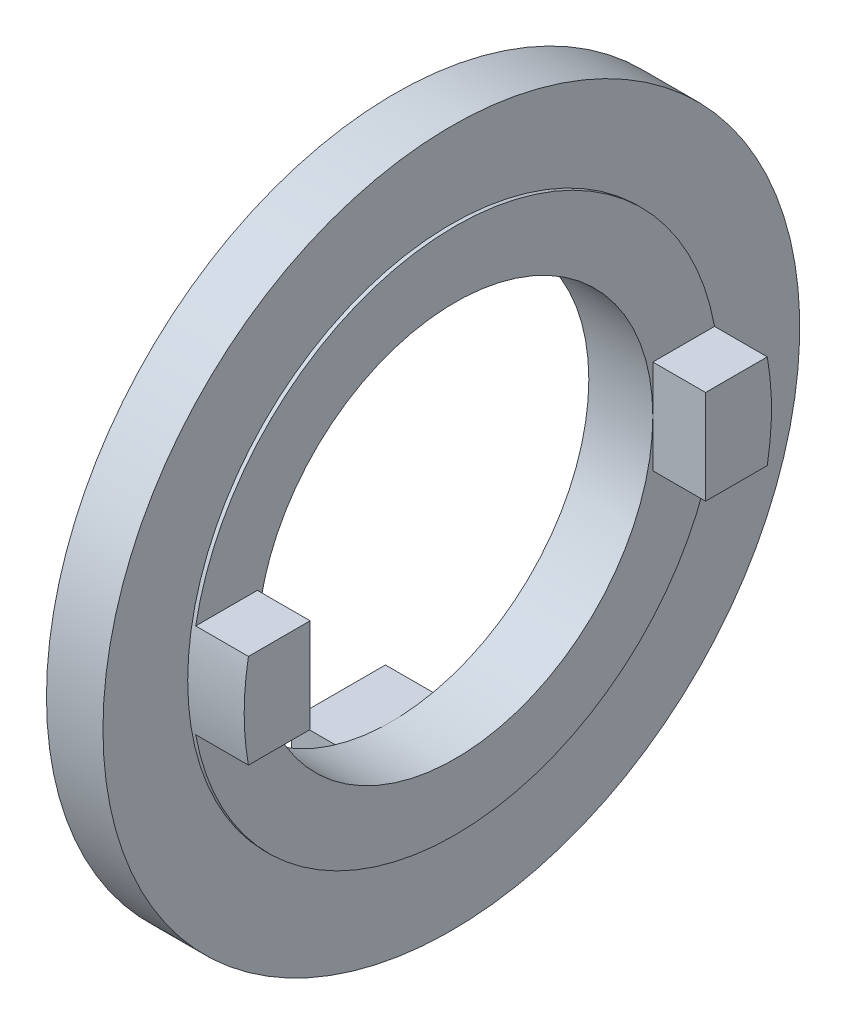
ISO-10303-21;
HEADER;
FILE_DESCRIPTION(('STEP AP214'),'2;1');
FILE_NAME('part.step','',(''),(''),'','','');
FILE_SCHEMA(('AUTOMOTIVE_DESIGN { 1 0 10303 214 1 1 1 1 }'));
ENDSEC;
DATA;
#1=APPLICATION_CONTEXT('core data for automotive mechanical design processes');
#2=APPLICATION_PROTOCOL_DEFINITION('international standard','automotive_design',2000,#1);
#3=PRODUCT_CONTEXT('',#1,'mechanical');
#4=PRODUCT('Part','Part','',(#3));
#5=PRODUCT_RELATED_PRODUCT_CATEGORY('part','',(#4));
#6=PRODUCT_DEFINITION_FORMATION('','',#4);
#7=PRODUCT_DEFINITION_CONTEXT('part definition',#1,'design');
#8=PRODUCT_DEFINITION('design','',#6,#7);
#9=PRODUCT_DEFINITION_SHAPE('','',#8);
#10=(LENGTH_UNIT() NAMED_UNIT(*) SI_UNIT(.MILLI.,.METRE.));
#11=(NAMED_UNIT(*) PLANE_ANGLE_UNIT() SI_UNIT($,.RADIAN.));
#12=(NAMED_UNIT(*) SI_UNIT($,.STERADIAN.) SOLID_ANGLE_UNIT());
#13=UNCERTAINTY_MEASURE_WITH_UNIT(LENGTH_MEASURE(1.E-05),#10,'distance_accuracy_value','');
#14=(GEOMETRIC_REPRESENTATION_CONTEXT(3) GLOBAL_UNCERTAINTY_ASSIGNED_CONTEXT((#13)) GLOBAL_UNIT_ASSIGNED_CONTEXT((#10,
#11,#12)) REPRESENTATION_CONTEXT('',''));
#15=CARTESIAN_POINT('',(0.,0.,0.));
#16=DIRECTION('',(0.,0.,1.));
#17=DIRECTION('',(1.,0.,0.));
#18=AXIS2_PLACEMENT_3D('',#15,#16,#17);
#19=CARTESIAN_POINT('',(0.,0.,0.));
#20=DIRECTION('',(-1.,0.,0.));
#21=DIRECTION('',(0.,0.,1.));
#22=AXIS2_PLACEMENT_3D('',#19,#20,#21);
#23=PLANE('',#22);
#24=DIRECTION('',(0.,1.,0.));
#25=VECTOR('',#24,1.);
#26=CARTESIAN_POINT('',(0.,10.5302728173508,2.5));
#27=LINE('',#26,#25);
#28=CARTESIAN_POINT('',(0.,13.7749773139559,2.5));
#29=VERTEX_POINT('',#28);
#30=CARTESIAN_POINT('',(0.,10.5302728173508,2.5));
#31=VERTEX_POINT('',#30);
#32=EDGE_CURVE('P0_E59',#29,#31,#27,.F.);
#33=ORIENTED_EDGE('',*,*,#32,.T.);
#34=DIRECTION('',(0.,0.,1.));
#35=VECTOR('',#34,1.);
#36=CARTESIAN_POINT('',(0.,10.5302728173508,2.5));
#37=LINE('',#36,#35);
#38=CARTESIAN_POINT('',(0.,10.5302728173508,-2.5));
#39=VERTEX_POINT('',#38);
#40=EDGE_CURVE('P0_E79',#31,#39,#37,.F.);
#41=ORIENTED_EDGE('',*,*,#40,.T.);
#42=DIRECTION('',(0.,1.,0.));
#43=VECTOR('',#42,1.);
#44=CARTESIAN_POINT('',(0.,10.5302728173508,-2.5));
#45=LINE('',#44,#43);
#46=CARTESIAN_POINT('',(0.,13.7749773139559,-2.5));
#47=VERTEX_POINT('',#46);
#48=EDGE_CURVE('P0_E60',#39,#47,#45,.T.);
#49=ORIENTED_EDGE('',*,*,#48,.T.);
#50=CARTESIAN_POINT('',(0.,0.,0.));
#51=DIRECTION('',(1.,0.,0.));
#52=DIRECTION('',(0.,0.,-1.));
#53=AXIS2_PLACEMENT_3D('',#50,#51,#52);
#54=CIRCLE('',#53,14.);
#55=EDGE_CURVE('P0_E20',#29,#47,#54,.F.);
#56=ORIENTED_EDGE('',*,*,#55,.F.);
#57=EDGE_LOOP('',(#33,#41,#49,#56));
#58=FACE_BOUND('',#57,.T.);
#59=ADVANCED_FACE('P0_F17',(#58),#23,.F.);
#60=CARTESIAN_POINT('',(-2.8,0.,0.));
#61=DIRECTION('',(1.,0.,0.));
#62=DIRECTION('',(0.,0.,-1.));
#63=AXIS2_PLACEMENT_3D('',#60,#61,#62);
#64=CYLINDRICAL_SURFACE('',#63,14.);
#65=CARTESIAN_POINT('',(-2.8,0.,0.));
#66=DIRECTION('',(1.,0.,0.));
#67=DIRECTION('',(0.,0.,-1.));
#68=AXIS2_PLACEMENT_3D('',#65,#66,#67);
#69=CIRCLE('',#68,14.);
#70=CARTESIAN_POINT('',(-2.8,13.7749773139559,2.5));
#71=VERTEX_POINT('',#70);
#72=CARTESIAN_POINT('',(-2.8,13.7749773139559,-2.5));
#73=VERTEX_POINT('',#72);
#74=EDGE_CURVE('P0_E68',#71,#73,#69,.F.);
#75=ORIENTED_EDGE('',*,*,#74,.F.);
#76=DIRECTION('',(-1.,0.,0.));
#77=VECTOR('',#76,1.);
#78=CARTESIAN_POINT('',(-2.8,13.7749773139559,2.5));
#79=LINE('',#78,#77);
#80=EDGE_CURVE('P0_E65',#71,#29,#79,.F.);
#81=ORIENTED_EDGE('',*,*,#80,.T.);
#82=ORIENTED_EDGE('',*,*,#55,.T.);
#83=DIRECTION('',(1.,0.,0.));
#84=VECTOR('',#83,1.);
#85=CARTESIAN_POINT('',(-2.8,13.7749773139559,-2.5));
#86=LINE('',#85,#84);
#87=EDGE_CURVE('P0_E63',#47,#73,#86,.F.);
#88=ORIENTED_EDGE('',*,*,#87,.T.);
#89=EDGE_LOOP('',(#75,#81,#82,#88));
#90=FACE_BOUND('',#89,.T.);
#91=ADVANCED_FACE('P0_F66',(#90),#64,.T.);
#92=CARTESIAN_POINT('',(-2.8,10.5302728173508,-2.5));
#93=DIRECTION('',(0.,0.,1.));
#94=DIRECTION('',(1.,0.,0.));
#95=AXIS2_PLACEMENT_3D('',#92,#93,#94);
#96=PLANE('',#95);
#97=DIRECTION('',(1.,0.,0.));
#98=VECTOR('',#97,1.);
#99=CARTESIAN_POINT('',(-2.8,10.5302728173508,-2.5));
#100=LINE('',#99,#98);
#101=CARTESIAN_POINT('',(-2.8,10.5302728173508,-2.5));
#102=VERTEX_POINT('',#101);
#103=EDGE_CURVE('P0_E81',#39,#102,#100,.F.);
#104=ORIENTED_EDGE('',*,*,#103,.T.);
#105=DIRECTION('',(0.,1.,0.));
#106=VECTOR('',#105,1.);
#107=CARTESIAN_POINT('',(-2.8,0.,-2.5));
#108=LINE('',#107,#106);
#109=EDGE_CURVE('P0_E73',#73,#102,#108,.F.);
#110=ORIENTED_EDGE('',*,*,#109,.F.);
#111=ORIENTED_EDGE('',*,*,#87,.F.);
#112=ORIENTED_EDGE('',*,*,#48,.F.);
#113=EDGE_LOOP('',(#104,#110,#111,#112));
#114=FACE_BOUND('',#113,.T.);
#115=ADVANCED_FACE('P0_F90',(#114),#96,.F.);
#116=CARTESIAN_POINT('',(-2.8,10.5302728173508,2.5));
#117=DIRECTION('',(0.,1.,0.));
#118=DIRECTION('',(0.,0.,1.));
#119=AXIS2_PLACEMENT_3D('',#116,#117,#118);
#120=PLANE('',#119);
#121=DIRECTION('',(-1.,0.,0.));
#122=VECTOR('',#121,1.);
#123=CARTESIAN_POINT('',(-2.8,10.5302728173508,2.5));
#124=LINE('',#123,#122);
#125=CARTESIAN_POINT('',(-2.8,10.5302728173508,2.5));
#126=VERTEX_POINT('',#125);
#127=EDGE_CURVE('P0_E35',#31,#126,#124,.T.);
#128=ORIENTED_EDGE('',*,*,#127,.T.);
#129=DIRECTION('',(0.,0.,1.));
#130=VECTOR('',#129,1.);
#131=CARTESIAN_POINT('',(-2.8,10.5302728173508,0.));
#132=LINE('',#131,#130);
#133=EDGE_CURVE('P0_E26',#102,#126,#132,.T.);
#134=ORIENTED_EDGE('',*,*,#133,.F.);
#135=ORIENTED_EDGE('',*,*,#103,.F.);
#136=ORIENTED_EDGE('',*,*,#40,.F.);
#137=EDGE_LOOP('',(#128,#134,#135,#136));
#138=FACE_BOUND('',#137,.T.);
#139=ADVANCED_FACE('P0_F107',(#138),#120,.F.);
#140=CARTESIAN_POINT('',(-2.8,10.5302728173508,2.5));
#141=DIRECTION('',(0.,0.,-1.));
#142=DIRECTION('',(-1.,0.,0.));
#143=AXIS2_PLACEMENT_3D('',#140,#141,#142);
#144=PLANE('',#143);
#145=ORIENTED_EDGE('',*,*,#80,.F.);
#146=DIRECTION('',(0.,1.,0.));
#147=VECTOR('',#146,1.);
#148=CARTESIAN_POINT('',(-2.8,0.,2.5));
#149=LINE('',#148,#147);
#150=EDGE_CURVE('P0_E11',#126,#71,#149,.T.);
#151=ORIENTED_EDGE('',*,*,#150,.F.);
#152=ORIENTED_EDGE('',*,*,#127,.F.);
#153=ORIENTED_EDGE('',*,*,#32,.F.);
#154=EDGE_LOOP('',(#145,#151,#152,#153));
#155=FACE_BOUND('',#154,.T.);
#156=ADVANCED_FACE('P0_F71',(#155),#144,.F.);
#157=CARTESIAN_POINT('',(-2.8,0.,0.));
#158=DIRECTION('',(-1.,0.,0.));
#159=DIRECTION('',(0.,0.,1.));
#160=AXIS2_PLACEMENT_3D('',#157,#158,#159);
#161=PLANE('',#160);
#162=ORIENTED_EDGE('',*,*,#133,.T.);
#163=ORIENTED_EDGE('',*,*,#150,.T.);
#164=ORIENTED_EDGE('',*,*,#74,.T.);
#165=ORIENTED_EDGE('',*,*,#109,.T.);
#166=EDGE_LOOP('',(#162,#163,#164,#165));
#167=FACE_BOUND('',#166,.T.);
#168=ADVANCED_FACE('P0_F95',(#167),#161,.T.);
#169=CLOSED_SHELL('',(#59,#91,#115,#139,#156,#168));
#170=MANIFOLD_SOLID_BREP('P0_B1',#169);
#171=CARTESIAN_POINT('',(6.2,-2.5,10.5));
#172=DIRECTION('',(0.,0.,1.));
#173=DIRECTION('',(1.,0.,0.));
#174=AXIS2_PLACEMENT_3D('',#171,#172,#173);
#175=PLANE('',#174);
#176=DIRECTION('',(0.,1.,0.));
#177=VECTOR('',#176,1.);
#178=CARTESIAN_POINT('',(3.4,10.5,10.5));
#179=LINE('',#178,#177);
#180=CARTESIAN_POINT('',(3.4,0.,10.5));
#181=VERTEX_POINT('',#180);
#182=CARTESIAN_POINT('',(3.4,2.5,10.5));
#183=VERTEX_POINT('',#182);
#184=EDGE_CURVE('P1_E103',#181,#183,#179,.T.);
#185=ORIENTED_EDGE('',*,*,#184,.T.);
#186=DIRECTION('',(1.,0.,0.));
#187=VECTOR('',#186,1.);
#188=CARTESIAN_POINT('',(6.2,2.5,10.5));
#189=LINE('',#188,#187);
#190=CARTESIAN_POINT('',(6.2,2.5,10.5));
#191=VERTEX_POINT('',#190);
#192=EDGE_CURVE('P1_E214',#183,#191,#189,.T.);
#193=ORIENTED_EDGE('',*,*,#192,.T.);
#194=DIRECTION('',(0.,1.,0.));
#195=VECTOR('',#194,1.);
#196=CARTESIAN_POINT('',(6.2,0.,10.5));
#197=LINE('',#196,#195);
#198=CARTESIAN_POINT('',(6.2,-2.5,10.5));
#199=VERTEX_POINT('',#198);
#200=EDGE_CURVE('P1_E162',#191,#199,#197,.F.);
#201=ORIENTED_EDGE('',*,*,#200,.T.);
#202=DIRECTION('',(1.,0.,0.));
#203=VECTOR('',#202,1.);
#204=CARTESIAN_POINT('',(6.2,-2.5,10.5));
#205=LINE('',#204,#203);
#206=CARTESIAN_POINT('',(3.4,-2.5,10.5));
#207=VERTEX_POINT('',#206);
#208=EDGE_CURVE('P1_E188',#199,#207,#205,.F.);
#209=ORIENTED_EDGE('',*,*,#208,.T.);
#210=DIRECTION('',(0.,1.,0.));
#211=VECTOR('',#210,1.);
#212=CARTESIAN_POINT('',(3.4,10.5,10.5));
#213=LINE('',#212,#211);
#214=EDGE_CURVE('P1_E157',#207,#181,#213,.T.);
#215=ORIENTED_EDGE('',*,*,#214,.T.);
#216=EDGE_LOOP('',(#185,#193,#201,#209,#215));
#217=FACE_BOUND('',#216,.T.);
#218=ADVANCED_FACE('P1_F17',(#217),#175,.F.);
#219=CARTESIAN_POINT('',(6.2,-2.5,-10.5));
#220=DIRECTION('',(0.,0.,-1.));
#221=DIRECTION('',(-1.,0.,0.));
#222=AXIS2_PLACEMENT_3D('',#219,#220,#221);
#223=PLANE('',#222);
#224=DIRECTION('',(0.,1.,0.));
#225=VECTOR('',#224,1.);
#226=CARTESIAN_POINT('',(3.4,10.5,-10.5));
#227=LINE('',#226,#225);
#228=CARTESIAN_POINT('',(3.4,0.,-10.5));
#229=VERTEX_POINT('',#228);
#230=CARTESIAN_POINT('',(3.4,-2.5,-10.5));
#231=VERTEX_POINT('',#230);
#232=EDGE_CURVE('P1_E93',#229,#231,#227,.F.);
#233=ORIENTED_EDGE('',*,*,#232,.T.);
#234=DIRECTION('',(1.,0.,0.));
#235=VECTOR('',#234,1.);
#236=CARTESIAN_POINT('',(6.2,-2.5,-10.5));
#237=LINE('',#236,#235);
#238=CARTESIAN_POINT('',(6.2,-2.5,-10.5));
#239=VERTEX_POINT('',#238);
#240=EDGE_CURVE('P1_E152',#231,#239,#237,.T.);
#241=ORIENTED_EDGE('',*,*,#240,.T.);
#242=DIRECTION('',(0.,1.,0.));
#243=VECTOR('',#242,1.);
#244=CARTESIAN_POINT('',(6.2,0.,-10.5));
#245=LINE('',#244,#243);
#246=CARTESIAN_POINT('',(6.2,2.5,-10.5));
#247=VERTEX_POINT('',#246);
#248=EDGE_CURVE('P1_E137',#247,#239,#245,.F.);
#249=ORIENTED_EDGE('',*,*,#248,.F.);
#250=DIRECTION('',(1.,0.,0.));
#251=VECTOR('',#250,1.);
#252=CARTESIAN_POINT('',(6.2,2.5,-10.5));
#253=LINE('',#252,#251);
#254=CARTESIAN_POINT('',(3.4,2.5,-10.5));
#255=VERTEX_POINT('',#254);
#256=EDGE_CURVE('P1_E178',#247,#255,#253,.F.);
#257=ORIENTED_EDGE('',*,*,#256,.T.);
#258=DIRECTION('',(0.,1.,0.));
#259=VECTOR('',#258,1.);
#260=CARTESIAN_POINT('',(3.4,10.5,-10.5));
#261=LINE('',#260,#259);
#262=EDGE_CURVE('P1_E112',#255,#229,#261,.F.);
#263=ORIENTED_EDGE('',*,*,#262,.T.);
#264=EDGE_LOOP('',(#233,#241,#249,#257,#263));
#265=FACE_BOUND('',#264,.T.);
#266=ADVANCED_FACE('P1_F153',(#265),#223,.F.);
#267=CARTESIAN_POINT('',(6.2,-2.5,-10.5));
#268=DIRECTION('',(0.,1.,0.));
#269=DIRECTION('',(0.,0.,1.));
#270=AXIS2_PLACEMENT_3D('',#267,#268,#269);
#271=PLANE('',#270);
#272=DIRECTION('',(-1.,0.,0.));
#273=VECTOR('',#272,1.);
#274=CARTESIAN_POINT('',(0.,-2.5,-13.7749773139559));
#275=LINE('',#274,#273);
#276=CARTESIAN_POINT('',(6.2,-2.5,-13.7749773139559));
#277=VERTEX_POINT('',#276);
#278=CARTESIAN_POINT('',(3.4,-2.5,-13.7749773139559));
#279=VERTEX_POINT('',#278);
#280=EDGE_CURVE('P1_E160',#277,#279,#275,.T.);
#281=ORIENTED_EDGE('',*,*,#280,.F.);
#282=DIRECTION('',(0.,0.,-1.));
#283=VECTOR('',#282,1.);
#284=CARTESIAN_POINT('',(6.2,-2.5,0.));
#285=LINE('',#284,#283);
#286=EDGE_CURVE('P1_E142',#239,#277,#285,.T.);
#287=ORIENTED_EDGE('',*,*,#286,.F.);
#288=ORIENTED_EDGE('',*,*,#240,.F.);
#289=DIRECTION('',(0.,0.,1.));
#290=VECTOR('',#289,1.);
#291=CARTESIAN_POINT('',(3.4,-2.5,0.));
#292=LINE('',#291,#290);
#293=EDGE_CURVE('P1_E191',#231,#279,#292,.F.);
#294=ORIENTED_EDGE('',*,*,#293,.T.);
#295=EDGE_LOOP('',(#281,#287,#288,#294));
#296=FACE_BOUND('',#295,.T.);
#297=ADVANCED_FACE('P1_F159',(#296),#271,.F.);
#298=CARTESIAN_POINT('',(3.4,10.5,0.));
#299=DIRECTION('',(-1.,0.,0.));
#300=DIRECTION('',(0.,0.,1.));
#301=AXIS2_PLACEMENT_3D('',#298,#299,#300);
#302=PLANE('',#301);
#303=CARTESIAN_POINT('',(3.4,0.,0.));
#304=DIRECTION('',(-1.,0.,0.));
#305=DIRECTION('',(0.,0.,1.));
#306=AXIS2_PLACEMENT_3D('',#303,#304,#305);
#307=CIRCLE('',#306,14.);
#308=CARTESIAN_POINT('',(3.4,-2.5,13.7749773139559));
#309=VERTEX_POINT('',#308);
#310=EDGE_CURVE('P1_E185',#279,#309,#307,.T.);
#311=ORIENTED_EDGE('',*,*,#310,.F.);
#312=ORIENTED_EDGE('',*,*,#293,.F.);
#313=ORIENTED_EDGE('',*,*,#232,.F.);
#314=CARTESIAN_POINT('',(3.4,0.,0.));
#315=DIRECTION('',(-1.,0.,0.));
#316=DIRECTION('',(0.,0.,1.));
#317=AXIS2_PLACEMENT_3D('',#314,#315,#316);
#318=CIRCLE('',#317,10.5);
#319=EDGE_CURVE('P1_E20',#229,#181,#318,.T.);
#320=ORIENTED_EDGE('',*,*,#319,.T.);
#321=ORIENTED_EDGE('',*,*,#214,.F.);
#322=DIRECTION('',(0.,0.,1.));
#323=VECTOR('',#322,1.);
#324=CARTESIAN_POINT('',(3.4,-2.5,10.5));
#325=LINE('',#324,#323);
#326=EDGE_CURVE('P1_E149',#207,#309,#325,.T.);
#327=ORIENTED_EDGE('',*,*,#326,.T.);
#328=EDGE_LOOP('',(#311,#312,#313,#320,#321,#327));
#329=FACE_BOUND('',#328,.T.);
#330=ADVANCED_FACE('P1_F439',(#329),#302,.F.);
#331=CARTESIAN_POINT('',(6.2,-2.5,10.5));
#332=DIRECTION('',(0.,1.,0.));
#333=DIRECTION('',(0.,0.,1.));
#334=AXIS2_PLACEMENT_3D('',#331,#332,#333);
#335=PLANE('',#334);
#336=ORIENTED_EDGE('',*,*,#208,.F.);
#337=DIRECTION('',(0.,0.,1.));
#338=VECTOR('',#337,1.);
#339=CARTESIAN_POINT('',(6.2,-2.5,0.));
#340=LINE('',#339,#338);
#341=CARTESIAN_POINT('',(6.2,-2.5,13.7749773139559));
#342=VERTEX_POINT('',#341);
#343=EDGE_CURVE('P1_E168',#199,#342,#340,.T.);
#344=ORIENTED_EDGE('',*,*,#343,.T.);
#345=DIRECTION('',(-1.,0.,0.));
#346=VECTOR('',#345,1.);
#347=CARTESIAN_POINT('',(0.,-2.5,13.7749773139559));
#348=LINE('',#347,#346);
#349=EDGE_CURVE('P1_E181',#309,#342,#348,.F.);
#350=ORIENTED_EDGE('',*,*,#349,.F.);
#351=ORIENTED_EDGE('',*,*,#326,.F.);
#352=EDGE_LOOP('',(#336,#344,#350,#351));
#353=FACE_BOUND('',#352,.T.);
#354=ADVANCED_FACE('P1_F292',(#353),#335,.F.);
#355=CARTESIAN_POINT('',(6.2,0.,0.));
#356=DIRECTION('',(1.,0.,0.));
#357=DIRECTION('',(0.,0.,-1.));
#358=AXIS2_PLACEMENT_3D('',#355,#356,#357);
#359=PLANE('',#358);
#360=ORIENTED_EDGE('',*,*,#248,.T.);
#361=ORIENTED_EDGE('',*,*,#286,.T.);
#362=CARTESIAN_POINT('',(6.2,0.,0.));
#363=DIRECTION('',(-1.,0.,0.));
#364=DIRECTION('',(0.,0.,1.));
#365=AXIS2_PLACEMENT_3D('',#362,#363,#364);
#366=CIRCLE('',#365,14.);
#367=CARTESIAN_POINT('',(6.2,2.5,-13.7749773139559));
#368=VERTEX_POINT('',#367);
#369=EDGE_CURVE('P1_E184',#368,#277,#366,.T.);
#370=ORIENTED_EDGE('',*,*,#369,.F.);
#371=DIRECTION('',(0.,0.,-1.));
#372=VECTOR('',#371,1.);
#373=CARTESIAN_POINT('',(6.2,2.5,-10.5));
#374=LINE('',#373,#372);
#375=EDGE_CURVE('P1_E144',#368,#247,#374,.F.);
#376=ORIENTED_EDGE('',*,*,#375,.T.);
#377=EDGE_LOOP('',(#360,#361,#370,#376));
#378=FACE_BOUND('',#377,.T.);
#379=ADVANCED_FACE('P1_F139',(#378),#359,.T.);
#380=CARTESIAN_POINT('',(6.2,0.,0.));
#381=DIRECTION('',(-1.,0.,0.));
#382=DIRECTION('',(0.,0.,1.));
#383=AXIS2_PLACEMENT_3D('',#380,#381,#382);
#384=PLANE('',#383);
#385=CARTESIAN_POINT('',(6.2,0.,0.));
#386=DIRECTION('',(-1.,0.,0.));
#387=DIRECTION('',(0.,0.,1.));
#388=AXIS2_PLACEMENT_3D('',#385,#386,#387);
#389=CIRCLE('',#388,14.);
#390=CARTESIAN_POINT('',(6.2,2.5,13.7749773139559));
#391=VERTEX_POINT('',#390);
#392=EDGE_CURVE('P1_E258',#342,#391,#389,.T.);
#393=ORIENTED_EDGE('',*,*,#392,.F.);
#394=ORIENTED_EDGE('',*,*,#343,.F.);
#395=ORIENTED_EDGE('',*,*,#200,.F.);
#396=DIRECTION('',(0.,0.,-1.));
#397=VECTOR('',#396,1.);
#398=CARTESIAN_POINT('',(6.2,2.5,10.5));
#399=LINE('',#398,#397);
#400=EDGE_CURVE('P1_E217',#191,#391,#399,.F.);
#401=ORIENTED_EDGE('',*,*,#400,.T.);
#402=EDGE_LOOP('',(#393,#394,#395,#401));
#403=FACE_BOUND('',#402,.T.);
#404=ADVANCED_FACE('P1_F295',(#403),#384,.F.);
#405=CARTESIAN_POINT('',(6.2,2.5,10.5));
#406=DIRECTION('',(0.,-1.,0.));
#407=DIRECTION('',(0.,0.,-1.));
#408=AXIS2_PLACEMENT_3D('',#405,#406,#407);
#409=PLANE('',#408);
#410=DIRECTION('',(-1.,0.,0.));
#411=VECTOR('',#410,1.);
#412=CARTESIAN_POINT('',(0.,2.5,13.7749773139559));
#413=LINE('',#412,#411);
#414=CARTESIAN_POINT('',(3.4,2.5,13.7749773139559));
#415=VERTEX_POINT('',#414);
#416=EDGE_CURVE('P1_E257',#391,#415,#413,.T.);
#417=ORIENTED_EDGE('',*,*,#416,.F.);
#418=ORIENTED_EDGE('',*,*,#400,.F.);
#419=ORIENTED_EDGE('',*,*,#192,.F.);
#420=DIRECTION('',(0.,0.,1.));
#421=VECTOR('',#420,1.);
#422=CARTESIAN_POINT('',(3.4,2.5,0.));
#423=LINE('',#422,#421);
#424=EDGE_CURVE('P1_E286',#183,#415,#423,.T.);
#425=ORIENTED_EDGE('',*,*,#424,.T.);
#426=EDGE_LOOP('',(#417,#418,#419,#425));
#427=FACE_BOUND('',#426,.T.);
#428=ADVANCED_FACE('P1_F301',(#427),#409,.F.);
#429=CARTESIAN_POINT('',(3.4,10.5,0.));
#430=DIRECTION('',(-1.,0.,0.));
#431=DIRECTION('',(0.,0.,1.));
#432=AXIS2_PLACEMENT_3D('',#429,#430,#431);
#433=PLANE('',#432);
#434=CARTESIAN_POINT('',(3.4,0.,0.));
#435=DIRECTION('',(-1.,0.,0.));
#436=DIRECTION('',(0.,0.,1.));
#437=AXIS2_PLACEMENT_3D('',#434,#435,#436);
#438=CIRCLE('',#437,10.5);
#439=EDGE_CURVE('P1_E206',#181,#229,#438,.T.);
#440=ORIENTED_EDGE('',*,*,#439,.T.);
#441=ORIENTED_EDGE('',*,*,#262,.F.);
#442=DIRECTION('',(0.,0.,-1.));
#443=VECTOR('',#442,1.);
#444=CARTESIAN_POINT('',(3.4,2.5,-10.5));
#445=LINE('',#444,#443);
#446=CARTESIAN_POINT('',(3.4,2.5,-13.7749773139559));
#447=VERTEX_POINT('',#446);
#448=EDGE_CURVE('P1_E209',#255,#447,#445,.T.);
#449=ORIENTED_EDGE('',*,*,#448,.T.);
#450=CARTESIAN_POINT('',(3.4,0.,0.));
#451=DIRECTION('',(-1.,0.,0.));
#452=DIRECTION('',(0.,0.,1.));
#453=AXIS2_PLACEMENT_3D('',#450,#451,#452);
#454=CIRCLE('',#453,14.);
#455=EDGE_CURVE('P1_E253',#415,#447,#454,.T.);
#456=ORIENTED_EDGE('',*,*,#455,.F.);
#457=ORIENTED_EDGE('',*,*,#424,.F.);
#458=ORIENTED_EDGE('',*,*,#184,.F.);
#459=EDGE_LOOP('',(#440,#441,#449,#456,#457,#458));
#460=FACE_BOUND('',#459,.T.);
#461=ADVANCED_FACE('P1_F302',(#460),#433,.F.);
#462=CARTESIAN_POINT('',(6.2,2.5,-10.5));
#463=DIRECTION('',(0.,-1.,0.));
#464=DIRECTION('',(0.,0.,-1.));
#465=AXIS2_PLACEMENT_3D('',#462,#463,#464);
#466=PLANE('',#465);
#467=ORIENTED_EDGE('',*,*,#256,.F.);
#468=ORIENTED_EDGE('',*,*,#375,.F.);
#469=DIRECTION('',(-1.,0.,0.));
#470=VECTOR('',#469,1.);
#471=CARTESIAN_POINT('',(0.,2.5,-13.7749773139559));
#472=LINE('',#471,#470);
#473=EDGE_CURVE('P1_E256',#447,#368,#472,.F.);
#474=ORIENTED_EDGE('',*,*,#473,.F.);
#475=ORIENTED_EDGE('',*,*,#448,.F.);
#476=EDGE_LOOP('',(#467,#468,#474,#475));
#477=FACE_BOUND('',#476,.T.);
#478=ADVANCED_FACE('P1_F424',(#477),#466,.F.);
#479=CARTESIAN_POINT('',(0.,0.,0.));
#480=DIRECTION('',(-1.,0.,0.));
#481=DIRECTION('',(0.,0.,1.));
#482=AXIS2_PLACEMENT_3D('',#479,#480,#481);
#483=CYLINDRICAL_SURFACE('',#482,10.5);
#484=ORIENTED_EDGE('',*,*,#439,.F.);
#485=ORIENTED_EDGE('',*,*,#319,.F.);
#486=EDGE_LOOP('',(#484,#485));
#487=FACE_BOUND('',#486,.T.);
#488=CARTESIAN_POINT('',(0.,0.,0.));
#489=DIRECTION('',(-1.,0.,0.));
#490=DIRECTION('',(0.,0.,1.));
#491=AXIS2_PLACEMENT_3D('',#488,#489,#490);
#492=CIRCLE('',#491,10.5);
#493=CARTESIAN_POINT('',(0.,0.,10.5));
#494=VERTEX_POINT('',#493);
#495=EDGE_CURVE('P1_E247',#494,#494,#492,.T.);
#496=ORIENTED_EDGE('',*,*,#495,.T.);
#497=EDGE_LOOP('',(#496));
#498=FACE_BOUND('',#497,.T.);
#499=ADVANCED_FACE('P1_F421',(#487,#498),#483,.F.);
#500=CARTESIAN_POINT('',(-2.8,-10.5302728173508,-2.5));
#501=DIRECTION('',(0.,-1.,0.));
#502=DIRECTION('',(0.,0.,-1.));
#503=AXIS2_PLACEMENT_3D('',#500,#501,#502);
#504=PLANE('',#503);
#505=DIRECTION('',(1.,0.,0.));
#506=VECTOR('',#505,1.);
#507=CARTESIAN_POINT('',(-2.8,-10.5302728173508,-2.5));
#508=LINE('',#507,#506);
#509=CARTESIAN_POINT('',(0.,-10.5302728173508,-2.5));
#510=VERTEX_POINT('',#509);
#511=CARTESIAN_POINT('',(-2.8,-10.5302728173508,-2.5));
#512=VERTEX_POINT('',#511);
#513=EDGE_CURVE('P1_E320',#510,#512,#508,.F.);
#514=ORIENTED_EDGE('',*,*,#513,.T.);
#515=DIRECTION('',(0.,0.,1.));
#516=VECTOR('',#515,1.);
#517=CARTESIAN_POINT('',(-2.8,-10.5302728173508,0.));
#518=LINE('',#517,#516);
#519=CARTESIAN_POINT('',(-2.8,-10.5302728173508,2.5));
#520=VERTEX_POINT('',#519);
#521=EDGE_CURVE('P1_E316',#520,#512,#518,.F.);
#522=ORIENTED_EDGE('',*,*,#521,.F.);
#523=DIRECTION('',(-1.,0.,0.));
#524=VECTOR('',#523,1.);
#525=CARTESIAN_POINT('',(-2.8,-10.5302728173508,2.5));
#526=LINE('',#525,#524);
#527=CARTESIAN_POINT('',(0.,-10.5302728173508,2.5));
#528=VERTEX_POINT('',#527);
#529=EDGE_CURVE('P1_E282',#520,#528,#526,.F.);
#530=ORIENTED_EDGE('',*,*,#529,.T.);
#531=DIRECTION('',(0.,0.,-1.));
#532=VECTOR('',#531,1.);
#533=CARTESIAN_POINT('',(0.,-10.5302728173508,0.));
#534=LINE('',#533,#532);
#535=EDGE_CURVE('P1_E329',#528,#510,#534,.T.);
#536=ORIENTED_EDGE('',*,*,#535,.T.);
#537=EDGE_LOOP('',(#514,#522,#530,#536));
#538=FACE_BOUND('',#537,.T.);
#539=ADVANCED_FACE('P1_F370',(#538),#504,.F.);
#540=CARTESIAN_POINT('',(0.,0.,0.));
#541=DIRECTION('',(-1.,0.,0.));
#542=DIRECTION('',(0.,0.,1.));
#543=AXIS2_PLACEMENT_3D('',#540,#541,#542);
#544=CYLINDRICAL_SURFACE('',#543,14.);
#545=CARTESIAN_POINT('',(3.2,0.,0.));
#546=DIRECTION('',(-1.,0.,0.));
#547=DIRECTION('',(0.,0.,1.));
#548=AXIS2_PLACEMENT_3D('',#545,#546,#547);
#549=CIRCLE('',#548,14.);
#550=CARTESIAN_POINT('',(3.2,0.,14.));
#551=VERTEX_POINT('',#550);
#552=EDGE_CURVE('P1_E242',#551,#551,#549,.F.);
#553=ORIENTED_EDGE('',*,*,#552,.T.);
#554=EDGE_LOOP('',(#553));
#555=FACE_BOUND('',#554,.T.);
#556=ORIENTED_EDGE('',*,*,#455,.T.);
#557=ORIENTED_EDGE('',*,*,#473,.T.);
#558=ORIENTED_EDGE('',*,*,#369,.T.);
#559=ORIENTED_EDGE('',*,*,#280,.T.);
#560=ORIENTED_EDGE('',*,*,#310,.T.);
#561=ORIENTED_EDGE('',*,*,#349,.T.);
#562=ORIENTED_EDGE('',*,*,#392,.T.);
#563=ORIENTED_EDGE('',*,*,#416,.T.);
#564=EDGE_LOOP('',(#556,#557,#558,#559,#560,#561,#562,#563));
#565=FACE_BOUND('',#564,.T.);
#566=ADVANCED_FACE('P1_F415',(#555,#565),#544,.T.);
#567=CARTESIAN_POINT('',(-2.8,-10.5302728173508,2.5));
#568=DIRECTION('',(0.,0.,-1.));
#569=DIRECTION('',(-1.,0.,0.));
#570=AXIS2_PLACEMENT_3D('',#567,#568,#569);
#571=PLANE('',#570);
#572=ORIENTED_EDGE('',*,*,#529,.F.);
#573=DIRECTION('',(0.,1.,0.));
#574=VECTOR('',#573,1.);
#575=CARTESIAN_POINT('',(-2.8,0.,2.5));
#576=LINE('',#575,#574);
#577=CARTESIAN_POINT('',(-2.8,-13.7749773139559,2.5));
#578=VERTEX_POINT('',#577);
#579=EDGE_CURVE('P1_E321',#578,#520,#576,.T.);
#580=ORIENTED_EDGE('',*,*,#579,.F.);
#581=DIRECTION('',(-1.,0.,0.));
#582=VECTOR('',#581,1.);
#583=CARTESIAN_POINT('',(0.,-13.7749773139559,2.49999999999999));
#584=LINE('',#583,#582);
#585=CARTESIAN_POINT('',(0.,-13.7749773139559,2.5));
#586=VERTEX_POINT('',#585);
#587=EDGE_CURVE('P1_E241',#586,#578,#584,.T.);
#588=ORIENTED_EDGE('',*,*,#587,.F.);
#589=DIRECTION('',(0.,1.,0.));
#590=VECTOR('',#589,1.);
#591=CARTESIAN_POINT('',(0.,10.5,2.5));
#592=LINE('',#591,#590);
#593=EDGE_CURVE('P1_E251',#586,#528,#592,.T.);
#594=ORIENTED_EDGE('',*,*,#593,.T.);
#595=EDGE_LOOP('',(#572,#580,#588,#594));
#596=FACE_BOUND('',#595,.T.);
#597=ADVANCED_FACE('P1_F377',(#596),#571,.F.);
#598=CARTESIAN_POINT('',(-2.8,0.,0.));
#599=DIRECTION('',(-1.,0.,0.));
#600=DIRECTION('',(0.,0.,1.));
#601=AXIS2_PLACEMENT_3D('',#598,#599,#600);
#602=PLANE('',#601);
#603=ORIENTED_EDGE('',*,*,#521,.T.);
#604=DIRECTION('',(0.,1.,0.));
#605=VECTOR('',#604,1.);
#606=CARTESIAN_POINT('',(-2.8,-10.5302728173508,-2.5));
#607=LINE('',#606,#605);
#608=CARTESIAN_POINT('',(-2.8,-13.7749773139559,-2.5));
#609=VERTEX_POINT('',#608);
#610=EDGE_CURVE('P1_E252',#512,#609,#607,.F.);
#611=ORIENTED_EDGE('',*,*,#610,.T.);
#612=CARTESIAN_POINT('',(-2.8,0.,0.));
#613=DIRECTION('',(-1.,0.,0.));
#614=DIRECTION('',(0.,0.,1.));
#615=AXIS2_PLACEMENT_3D('',#612,#613,#614);
#616=CIRCLE('',#615,14.);
#617=EDGE_CURVE('P1_E238',#578,#609,#616,.F.);
#618=ORIENTED_EDGE('',*,*,#617,.F.);
#619=ORIENTED_EDGE('',*,*,#579,.T.);
#620=EDGE_LOOP('',(#603,#611,#618,#619));
#621=FACE_BOUND('',#620,.T.);
#622=ADVANCED_FACE('P1_F382',(#621),#602,.T.);
#623=CARTESIAN_POINT('',(-2.8,-10.5302728173508,-2.5));
#624=DIRECTION('',(0.,0.,1.));
#625=DIRECTION('',(1.,0.,0.));
#626=AXIS2_PLACEMENT_3D('',#623,#624,#625);
#627=PLANE('',#626);
#628=DIRECTION('',(-1.,0.,0.));
#629=VECTOR('',#628,1.);
#630=CARTESIAN_POINT('',(0.,-13.7749773139559,-2.5));
#631=LINE('',#630,#629);
#632=CARTESIAN_POINT('',(0.,-13.7749773139559,-2.5));
#633=VERTEX_POINT('',#632);
#634=EDGE_CURVE('P1_E237',#609,#633,#631,.F.);
#635=ORIENTED_EDGE('',*,*,#634,.F.);
#636=ORIENTED_EDGE('',*,*,#610,.F.);
#637=ORIENTED_EDGE('',*,*,#513,.F.);
#638=DIRECTION('',(0.,1.,0.));
#639=VECTOR('',#638,1.);
#640=CARTESIAN_POINT('',(0.,10.5,-2.5));
#641=LINE('',#640,#639);
#642=EDGE_CURVE('P1_E246',#510,#633,#641,.F.);
#643=ORIENTED_EDGE('',*,*,#642,.T.);
#644=EDGE_LOOP('',(#635,#636,#637,#643));
#645=FACE_BOUND('',#644,.T.);
#646=ADVANCED_FACE('P1_F362',(#645),#627,.F.);
#647=CARTESIAN_POINT('',(0.,10.5,0.));
#648=DIRECTION('',(1.,0.,0.));
#649=DIRECTION('',(0.,0.,-1.));
#650=AXIS2_PLACEMENT_3D('',#647,#648,#649);
#651=PLANE('',#650);
#652=ORIENTED_EDGE('',*,*,#535,.F.);
#653=ORIENTED_EDGE('',*,*,#593,.F.);
#654=CARTESIAN_POINT('',(0.,0.,0.));
#655=DIRECTION('',(-1.,0.,0.));
#656=DIRECTION('',(0.,0.,1.));
#657=AXIS2_PLACEMENT_3D('',#654,#655,#656);
#658=CIRCLE('',#657,14.);
#659=EDGE_CURVE('P1_E40',#633,#586,#658,.F.);
#660=ORIENTED_EDGE('',*,*,#659,.F.);
#661=ORIENTED_EDGE('',*,*,#642,.F.);
#662=EDGE_LOOP('',(#652,#653,#660,#661));
#663=FACE_BOUND('',#662,.T.);
#664=ORIENTED_EDGE('',*,*,#495,.F.);
#665=EDGE_LOOP('',(#664));
#666=FACE_BOUND('',#665,.T.);
#667=ADVANCED_FACE('P1_F365',(#663,#666),#651,.F.);
#668=CARTESIAN_POINT('',(3.2,18.5,0.));
#669=DIRECTION('',(-1.,0.,0.));
#670=DIRECTION('',(0.,0.,1.));
#671=AXIS2_PLACEMENT_3D('',#668,#669,#670);
#672=PLANE('',#671);
#673=ORIENTED_EDGE('',*,*,#552,.F.);
#674=EDGE_LOOP('',(#673));
#675=FACE_BOUND('',#674,.T.);
#676=CARTESIAN_POINT('',(3.2,0.,0.));
#677=DIRECTION('',(-1.,0.,0.));
#678=DIRECTION('',(0.,0.,1.));
#679=AXIS2_PLACEMENT_3D('',#676,#677,#678);
#680=CIRCLE('',#679,18.5);
#681=CARTESIAN_POINT('',(3.2,0.,18.5));
#682=VERTEX_POINT('',#681);
#683=EDGE_CURVE('P1_E231',#682,#682,#680,.T.);
#684=ORIENTED_EDGE('',*,*,#683,.F.);
#685=EDGE_LOOP('',(#684));
#686=FACE_BOUND('',#685,.T.);
#687=ADVANCED_FACE('P1_F388',(#675,#686),#672,.F.);
#688=CARTESIAN_POINT('',(0.,0.,0.));
#689=DIRECTION('',(-1.,0.,0.));
#690=DIRECTION('',(0.,0.,1.));
#691=AXIS2_PLACEMENT_3D('',#688,#689,#690);
#692=CYLINDRICAL_SURFACE('',#691,14.);
#693=ORIENTED_EDGE('',*,*,#634,.T.);
#694=ORIENTED_EDGE('',*,*,#659,.T.);
#695=ORIENTED_EDGE('',*,*,#587,.T.);
#696=ORIENTED_EDGE('',*,*,#617,.T.);
#697=EDGE_LOOP('',(#693,#694,#695,#696));
#698=FACE_BOUND('',#697,.T.);
#699=CARTESIAN_POINT('',(0.2,0.,0.));
#700=DIRECTION('',(-1.,0.,0.));
#701=DIRECTION('',(0.,0.,1.));
#702=AXIS2_PLACEMENT_3D('',#699,#700,#701);
#703=CIRCLE('',#702,14.);
#704=CARTESIAN_POINT('',(0.2,0.,14.));
#705=VERTEX_POINT('',#704);
#706=EDGE_CURVE('P1_E27',#705,#705,#703,.T.);
#707=ORIENTED_EDGE('',*,*,#706,.T.);
#708=EDGE_LOOP('',(#707));
#709=FACE_BOUND('',#708,.T.);
#710=ADVANCED_FACE('P1_F384',(#698,#709),#692,.T.);
#711=CARTESIAN_POINT('',(0.,0.,0.));
#712=DIRECTION('',(-1.,0.,0.));
#713=DIRECTION('',(0.,0.,1.));
#714=AXIS2_PLACEMENT_3D('',#711,#712,#713);
#715=CYLINDRICAL_SURFACE('',#714,18.5);
#716=CARTESIAN_POINT('',(0.2,0.,0.));
#717=DIRECTION('',(-1.,0.,0.));
#718=DIRECTION('',(0.,0.,1.));
#719=AXIS2_PLACEMENT_3D('',#716,#717,#718);
#720=CIRCLE('',#719,18.5);
#721=CARTESIAN_POINT('',(0.2,0.,18.5));
#722=VERTEX_POINT('',#721);
#723=EDGE_CURVE('P1_E11',#722,#722,#720,.F.);
#724=ORIENTED_EDGE('',*,*,#723,.T.);
#725=EDGE_LOOP('',(#724));
#726=FACE_BOUND('',#725,.T.);
#727=ORIENTED_EDGE('',*,*,#683,.T.);
#728=EDGE_LOOP('',(#727));
#729=FACE_BOUND('',#728,.T.);
#730=ADVANCED_FACE('P1_F387',(#726,#729),#715,.T.);
#731=CARTESIAN_POINT('',(0.2,14.,0.));
#732=DIRECTION('',(1.,0.,0.));
#733=DIRECTION('',(0.,0.,-1.));
#734=AXIS2_PLACEMENT_3D('',#731,#732,#733);
#735=PLANE('',#734);
#736=ORIENTED_EDGE('',*,*,#723,.F.);
#737=EDGE_LOOP('',(#736));
#738=FACE_BOUND('',#737,.T.);
#739=ORIENTED_EDGE('',*,*,#706,.F.);
#740=EDGE_LOOP('',(#739));
#741=FACE_BOUND('',#740,.T.);
#742=ADVANCED_FACE('P1_F392',(#738,#741),#735,.F.);
#743=CLOSED_SHELL('',(#218,#266,#297,#330,#354,#379,#404,#428,#461,#478,#499,#539,#566,#597,
#622,#646,#667,#687,#710,#730,#742));
#744=MANIFOLD_SOLID_BREP('P1_B1',#743);
#745=ADVANCED_BREP_SHAPE_REPRESENTATION('',(#18,#170,#744),#14);
#746=SHAPE_DEFINITION_REPRESENTATION(#9,#745);
ENDSEC;
END-ISO-10303-21;
